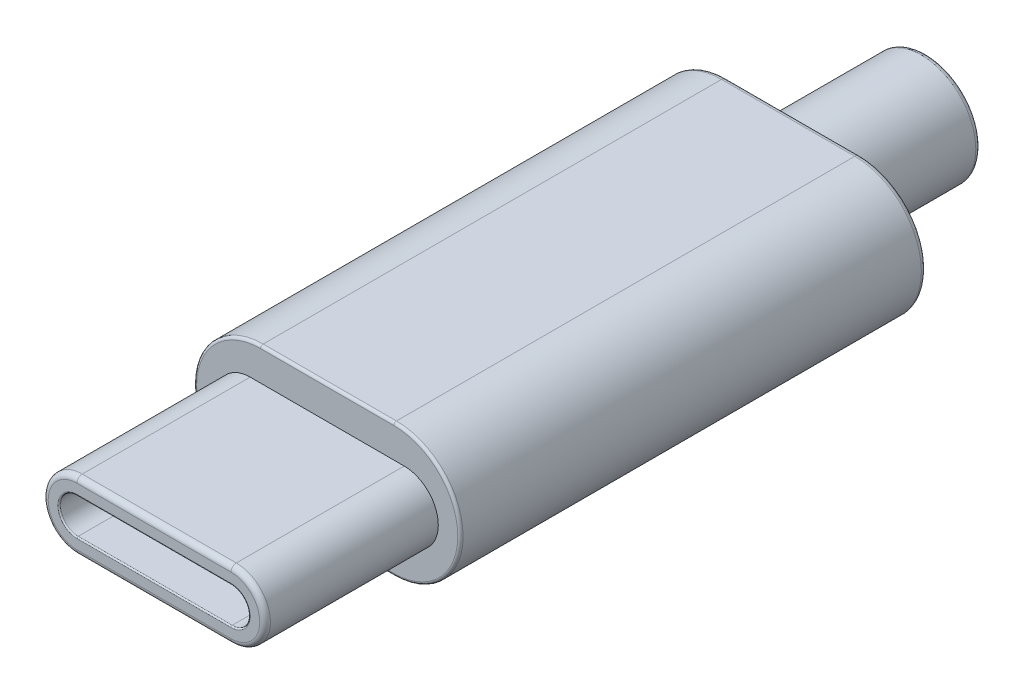
ISO-10303-21;
HEADER;
FILE_DESCRIPTION(('STEP AP214'),'2;1');
FILE_NAME('part.step','',(''),(''),'','','');
FILE_SCHEMA(('AUTOMOTIVE_DESIGN { 1 0 10303 214 1 1 1 1 }'));
ENDSEC;
DATA;
#1=APPLICATION_CONTEXT('core data for automotive mechanical design processes');
#2=APPLICATION_PROTOCOL_DEFINITION('international standard','automotive_design',2000,#1);
#3=PRODUCT_CONTEXT('',#1,'mechanical');
#4=PRODUCT('Part','Part','',(#3));
#5=PRODUCT_RELATED_PRODUCT_CATEGORY('part','',(#4));
#6=PRODUCT_DEFINITION_FORMATION('','',#4);
#7=PRODUCT_DEFINITION_CONTEXT('part definition',#1,'design');
#8=PRODUCT_DEFINITION('design','',#6,#7);
#9=PRODUCT_DEFINITION_SHAPE('','',#8);
#10=(LENGTH_UNIT() NAMED_UNIT(*) SI_UNIT(.MILLI.,.METRE.));
#11=(NAMED_UNIT(*) PLANE_ANGLE_UNIT() SI_UNIT($,.RADIAN.));
#12=(NAMED_UNIT(*) SI_UNIT($,.STERADIAN.) SOLID_ANGLE_UNIT());
#13=UNCERTAINTY_MEASURE_WITH_UNIT(LENGTH_MEASURE(1.E-05),#10,'distance_accuracy_value','');
#14=(GEOMETRIC_REPRESENTATION_CONTEXT(3) GLOBAL_UNCERTAINTY_ASSIGNED_CONTEXT((#13)) GLOBAL_UNIT_ASSIGNED_CONTEXT((#10,
#11,#12)) REPRESENTATION_CONTEXT('',''));
#15=CARTESIAN_POINT('',(0.,0.,0.));
#16=DIRECTION('',(0.,0.,1.));
#17=DIRECTION('',(1.,0.,0.));
#18=AXIS2_PLACEMENT_3D('',#15,#16,#17);
#19=CARTESIAN_POINT('',(0.,0.,0.));
#20=DIRECTION('',(0.,0.,1.));
#21=DIRECTION('',(1.,0.,0.));
#22=AXIS2_PLACEMENT_3D('',#19,#20,#21);
#23=PLANE('',#22);
#24=DIRECTION('',(-1.,0.,0.));
#25=VECTOR('',#24,1.);
#26=CARTESIAN_POINT('',(2.89,-1.28,0.));
#27=LINE('',#26,#25);
#28=CARTESIAN_POINT('',(2.89,-1.28,0.));
#29=VERTEX_POINT('',#28);
#30=CARTESIAN_POINT('',(-2.89,-1.28,0.));
#31=VERTEX_POINT('',#30);
#32=EDGE_CURVE('P0_E10',#29,#31,#27,.T.);
#33=ORIENTED_EDGE('',*,*,#32,.T.);
#34=CARTESIAN_POINT('',(-2.89,0.,0.));
#35=DIRECTION('',(0.,0.,-1.));
#36=DIRECTION('',(0.,-1.,0.));
#37=AXIS2_PLACEMENT_3D('',#34,#35,#36);
#38=CIRCLE('',#37,1.28);
#39=CARTESIAN_POINT('',(-2.89,1.28,0.));
#40=VERTEX_POINT('',#39);
#41=EDGE_CURVE('P0_E27',#31,#40,#38,.T.);
#42=ORIENTED_EDGE('',*,*,#41,.T.);
#43=DIRECTION('',(1.,0.,0.));
#44=VECTOR('',#43,1.);
#45=CARTESIAN_POINT('',(-2.89,1.28,0.));
#46=LINE('',#45,#44);
#47=CARTESIAN_POINT('',(2.89,1.28,0.));
#48=VERTEX_POINT('',#47);
#49=EDGE_CURVE('P0_E248',#40,#48,#46,.T.);
#50=ORIENTED_EDGE('',*,*,#49,.T.);
#51=CARTESIAN_POINT('',(2.89,0.,0.));
#52=DIRECTION('',(0.,0.,-1.));
#53=DIRECTION('',(0.,1.,0.));
#54=AXIS2_PLACEMENT_3D('',#51,#52,#53);
#55=CIRCLE('',#54,1.28);
#56=EDGE_CURVE('P0_E199',#48,#29,#55,.T.);
#57=ORIENTED_EDGE('',*,*,#56,.T.);
#58=EDGE_LOOP('',(#33,#42,#50,#57));
#59=FACE_BOUND('',#58,.T.);
#60=ADVANCED_FACE('P0_F16',(#59),#23,.F.);
#61=CARTESIAN_POINT('',(1.445,0.717981581539839,6.45));
#62=DIRECTION('',(1.,0.,0.));
#63=DIRECTION('',(0.,-0.707106781186555,0.70710678118654));
#64=AXIS2_PLACEMENT_3D('',#61,#62,#63);
#65=CYLINDRICAL_SURFACE('',#64,0.05);
#66=CARTESIAN_POINT('',(-2.89,0.717981581539839,6.45));
#67=DIRECTION('',(1.,0.,0.));
#68=DIRECTION('',(0.,0.,1.));
#69=AXIS2_PLACEMENT_3D('',#66,#67,#68);
#70=CIRCLE('',#69,0.05);
#71=CARTESIAN_POINT('',(-2.89,0.717981581539839,6.5));
#72=VERTEX_POINT('',#71);
#73=CARTESIAN_POINT('',(-2.89,0.667981581539839,6.45));
#74=VERTEX_POINT('',#73);
#75=EDGE_CURVE('P0_E195',#72,#74,#70,.T.);
#76=ORIENTED_EDGE('',*,*,#75,.T.);
#77=DIRECTION('',(1.,0.,0.));
#78=VECTOR('',#77,1.);
#79=CARTESIAN_POINT('',(1.445,0.667981581539839,6.45));
#80=LINE('',#79,#78);
#81=CARTESIAN_POINT('',(2.89,0.667981581539839,6.45));
#82=VERTEX_POINT('',#81);
#83=EDGE_CURVE('P0_E200',#74,#82,#80,.T.);
#84=ORIENTED_EDGE('',*,*,#83,.T.);
#85=CARTESIAN_POINT('',(2.89,0.717981581539839,6.45));
#86=DIRECTION('',(-1.,0.,0.));
#87=DIRECTION('',(0.,-1.,0.));
#88=AXIS2_PLACEMENT_3D('',#85,#86,#87);
#89=CIRCLE('',#88,0.05);
#90=CARTESIAN_POINT('',(2.89,0.717981581539839,6.5));
#91=VERTEX_POINT('',#90);
#92=EDGE_CURVE('P0_E244',#82,#91,#89,.T.);
#93=ORIENTED_EDGE('',*,*,#92,.T.);
#94=DIRECTION('',(-1.,0.,0.));
#95=VECTOR('',#94,1.);
#96=CARTESIAN_POINT('',(1.445,0.717981581539839,6.5));
#97=LINE('',#96,#95);
#98=EDGE_CURVE('P0_E193',#91,#72,#97,.T.);
#99=ORIENTED_EDGE('',*,*,#98,.T.);
#100=EDGE_LOOP('',(#76,#84,#93,#99));
#101=FACE_BOUND('',#100,.T.);
#102=ADVANCED_FACE('P0_F430',(#101),#65,.T.);
#103=CARTESIAN_POINT('',(2.89,0.,6.45));
#104=DIRECTION('',(0.,0.,-1.));
#105=DIRECTION('',(1.,0.,0.));
#106=AXIS2_PLACEMENT_3D('',#103,#104,#105);
#107=TOROIDAL_SURFACE('',#106,0.717981581539839,0.05);
#108=CARTESIAN_POINT('',(2.89,-0.717981581539839,6.45));
#109=DIRECTION('',(1.,0.,0.));
#110=DIRECTION('',(0.,1.,0.));
#111=AXIS2_PLACEMENT_3D('',#108,#109,#110);
#112=CIRCLE('',#111,0.05);
#113=CARTESIAN_POINT('',(2.89,-0.667981581539839,6.45));
#114=VERTEX_POINT('',#113);
#115=CARTESIAN_POINT('',(2.89,-0.717981581539839,6.5));
#116=VERTEX_POINT('',#115);
#117=EDGE_CURVE('P0_E155',#114,#116,#112,.T.);
#118=ORIENTED_EDGE('',*,*,#117,.T.);
#119=CARTESIAN_POINT('',(2.89,0.,6.5));
#120=DIRECTION('',(0.,0.,1.));
#121=DIRECTION('',(1.,0.,0.));
#122=AXIS2_PLACEMENT_3D('',#119,#120,#121);
#123=CIRCLE('',#122,0.717981581539839);
#124=EDGE_CURVE('P0_E194',#116,#91,#123,.T.);
#125=ORIENTED_EDGE('',*,*,#124,.T.);
#126=ORIENTED_EDGE('',*,*,#92,.F.);
#127=CARTESIAN_POINT('',(2.89,0.,6.45));
#128=DIRECTION('',(0.,0.,-1.));
#129=DIRECTION('',(1.,0.,0.));
#130=AXIS2_PLACEMENT_3D('',#127,#128,#129);
#131=CIRCLE('',#130,0.667981581539839);
#132=EDGE_CURVE('P0_E165',#82,#114,#131,.T.);
#133=ORIENTED_EDGE('',*,*,#132,.T.);
#134=EDGE_LOOP('',(#118,#125,#126,#133));
#135=FACE_BOUND('',#134,.T.);
#136=ADVANCED_FACE('P0_F450',(#135),#107,.T.);
#137=CARTESIAN_POINT('',(-1.445,-0.717981581539839,6.45));
#138=DIRECTION('',(-1.,0.,0.));
#139=DIRECTION('',(0.,0.707106781186555,0.70710678118654));
#140=AXIS2_PLACEMENT_3D('',#137,#138,#139);
#141=CYLINDRICAL_SURFACE('',#140,0.05);
#142=CARTESIAN_POINT('',(-2.89,-0.717981581539839,6.45));
#143=DIRECTION('',(1.,0.,0.));
#144=DIRECTION('',(0.,1.,0.));
#145=AXIS2_PLACEMENT_3D('',#142,#143,#144);
#146=CIRCLE('',#145,0.05);
#147=CARTESIAN_POINT('',(-2.89,-0.667981581539839,6.45));
#148=VERTEX_POINT('',#147);
#149=CARTESIAN_POINT('',(-2.89,-0.717981581539839,6.5));
#150=VERTEX_POINT('',#149);
#151=EDGE_CURVE('P0_E152',#148,#150,#146,.T.);
#152=ORIENTED_EDGE('',*,*,#151,.T.);
#153=DIRECTION('',(1.,0.,0.));
#154=VECTOR('',#153,1.);
#155=CARTESIAN_POINT('',(-1.445,-0.717981581539839,6.5));
#156=LINE('',#155,#154);
#157=EDGE_CURVE('P0_E160',#150,#116,#156,.T.);
#158=ORIENTED_EDGE('',*,*,#157,.T.);
#159=ORIENTED_EDGE('',*,*,#117,.F.);
#160=DIRECTION('',(-1.,0.,0.));
#161=VECTOR('',#160,1.);
#162=CARTESIAN_POINT('',(-1.445,-0.667981581539839,6.45));
#163=LINE('',#162,#161);
#164=EDGE_CURVE('P0_E149',#114,#148,#163,.T.);
#165=ORIENTED_EDGE('',*,*,#164,.T.);
#166=EDGE_LOOP('',(#152,#158,#159,#165));
#167=FACE_BOUND('',#166,.T.);
#168=ADVANCED_FACE('P0_F150',(#167),#141,.T.);
#169=CARTESIAN_POINT('',(-2.89,0.,6.45));
#170=DIRECTION('',(0.,0.,-1.));
#171=DIRECTION('',(-1.,0.,0.));
#172=AXIS2_PLACEMENT_3D('',#169,#170,#171);
#173=TOROIDAL_SURFACE('',#172,0.717981581539839,0.05);
#174=ORIENTED_EDGE('',*,*,#75,.F.);
#175=CARTESIAN_POINT('',(-2.89,0.,6.5));
#176=DIRECTION('',(0.,0.,1.));
#177=DIRECTION('',(-1.,0.,0.));
#178=AXIS2_PLACEMENT_3D('',#175,#176,#177);
#179=CIRCLE('',#178,0.717981581539839);
#180=EDGE_CURVE('P0_E143',#72,#150,#179,.T.);
#181=ORIENTED_EDGE('',*,*,#180,.T.);
#182=ORIENTED_EDGE('',*,*,#151,.F.);
#183=CARTESIAN_POINT('',(-2.89,0.,6.45));
#184=DIRECTION('',(0.,0.,-1.));
#185=DIRECTION('',(-1.,0.,0.));
#186=AXIS2_PLACEMENT_3D('',#183,#184,#185);
#187=CIRCLE('',#186,0.667981581539839);
#188=EDGE_CURVE('P0_E130',#148,#74,#187,.T.);
#189=ORIENTED_EDGE('',*,*,#188,.T.);
#190=EDGE_LOOP('',(#174,#181,#182,#189));
#191=FACE_BOUND('',#190,.T.);
#192=ADVANCED_FACE('P0_F162',(#191),#173,.T.);
#193=CARTESIAN_POINT('',(2.89,0.,0.));
#194=DIRECTION('',(0.,0.,1.));
#195=DIRECTION('',(0.,1.,0.));
#196=AXIS2_PLACEMENT_3D('',#193,#194,#195);
#197=CYLINDRICAL_SURFACE('',#196,0.667981581539839);
#198=ORIENTED_EDGE('',*,*,#132,.F.);
#199=DIRECTION('',(0.,0.,1.));
#200=VECTOR('',#199,1.);
#201=CARTESIAN_POINT('',(2.89,0.667981581539839,0.));
#202=LINE('',#201,#200);
#203=CARTESIAN_POINT('',(2.89,0.667981581539839,2.1294355142821));
#204=VERTEX_POINT('',#203);
#205=EDGE_CURVE('P0_E269',#204,#82,#202,.T.);
#206=ORIENTED_EDGE('',*,*,#205,.F.);
#207=CARTESIAN_POINT('',(2.89,0.,2.1294355142821));
#208=DIRECTION('',(0.,0.,-1.));
#209=DIRECTION('',(0.,1.,0.));
#210=AXIS2_PLACEMENT_3D('',#207,#208,#209);
#211=CIRCLE('',#210,0.667981581539839);
#212=CARTESIAN_POINT('',(2.89,-0.667981581539839,2.1294355142821));
#213=VERTEX_POINT('',#212);
#214=EDGE_CURVE('P0_E144',#204,#213,#211,.T.);
#215=ORIENTED_EDGE('',*,*,#214,.T.);
#216=DIRECTION('',(0.,0.,1.));
#217=VECTOR('',#216,1.);
#218=CARTESIAN_POINT('',(2.89,-0.667981581539839,0.));
#219=LINE('',#218,#217);
#220=EDGE_CURVE('P0_E262',#213,#114,#219,.T.);
#221=ORIENTED_EDGE('',*,*,#220,.T.);
#222=EDGE_LOOP('',(#198,#206,#215,#221));
#223=FACE_BOUND('',#222,.T.);
#224=ADVANCED_FACE('P0_F482',(#223),#197,.F.);
#225=CARTESIAN_POINT('',(2.89,0.667981581539839,0.));
#226=DIRECTION('',(0.,1.,0.));
#227=DIRECTION('',(1.,0.,0.));
#228=AXIS2_PLACEMENT_3D('',#225,#226,#227);
#229=PLANE('',#228);
#230=ORIENTED_EDGE('',*,*,#83,.F.);
#231=DIRECTION('',(0.,0.,1.));
#232=VECTOR('',#231,1.);
#233=CARTESIAN_POINT('',(-2.89,0.667981581539839,0.));
#234=LINE('',#233,#232);
#235=CARTESIAN_POINT('',(-2.89,0.667981581539839,2.1294355142821));
#236=VERTEX_POINT('',#235);
#237=EDGE_CURVE('P0_E137',#236,#74,#234,.T.);
#238=ORIENTED_EDGE('',*,*,#237,.F.);
#239=DIRECTION('',(1.,0.,0.));
#240=VECTOR('',#239,1.);
#241=CARTESIAN_POINT('',(1.445,0.667981581539839,2.1294355142821));
#242=LINE('',#241,#240);
#243=EDGE_CURVE('P0_E265',#236,#204,#242,.T.);
#244=ORIENTED_EDGE('',*,*,#243,.T.);
#245=ORIENTED_EDGE('',*,*,#205,.T.);
#246=EDGE_LOOP('',(#230,#238,#244,#245));
#247=FACE_BOUND('',#246,.T.);
#248=ADVANCED_FACE('P0_F465',(#247),#229,.F.);
#249=CARTESIAN_POINT('',(0.,0.,6.5));
#250=DIRECTION('',(0.,0.,1.));
#251=DIRECTION('',(1.,0.,0.));
#252=AXIS2_PLACEMENT_3D('',#249,#250,#251);
#253=PLANE('',#252);
#254=CARTESIAN_POINT('',(2.89,0.,6.5));
#255=DIRECTION('',(0.,0.,-1.));
#256=DIRECTION('',(1.,0.,0.));
#257=AXIS2_PLACEMENT_3D('',#254,#255,#256);
#258=CIRCLE('',#257,1.08);
#259=CARTESIAN_POINT('',(2.89,1.08,6.5));
#260=VERTEX_POINT('',#259);
#261=CARTESIAN_POINT('',(2.89,-1.08,6.5));
#262=VERTEX_POINT('',#261);
#263=EDGE_CURVE('P0_E219',#260,#262,#258,.T.);
#264=ORIENTED_EDGE('',*,*,#263,.F.);
#265=DIRECTION('',(1.,0.,0.));
#266=VECTOR('',#265,1.);
#267=CARTESIAN_POINT('',(1.445,1.08,6.5));
#268=LINE('',#267,#266);
#269=CARTESIAN_POINT('',(-2.89,1.08,6.5));
#270=VERTEX_POINT('',#269);
#271=EDGE_CURVE('P0_E220',#270,#260,#268,.T.);
#272=ORIENTED_EDGE('',*,*,#271,.F.);
#273=CARTESIAN_POINT('',(-2.89,0.,6.5));
#274=DIRECTION('',(0.,0.,-1.));
#275=DIRECTION('',(-1.,0.,0.));
#276=AXIS2_PLACEMENT_3D('',#273,#274,#275);
#277=CIRCLE('',#276,1.08);
#278=CARTESIAN_POINT('',(-2.89,-1.08,6.5));
#279=VERTEX_POINT('',#278);
#280=EDGE_CURVE('P0_E201',#279,#270,#277,.T.);
#281=ORIENTED_EDGE('',*,*,#280,.F.);
#282=DIRECTION('',(-1.,0.,0.));
#283=VECTOR('',#282,1.);
#284=CARTESIAN_POINT('',(-1.445,-1.08,6.5));
#285=LINE('',#284,#283);
#286=EDGE_CURVE('P0_E172',#262,#279,#285,.T.);
#287=ORIENTED_EDGE('',*,*,#286,.F.);
#288=EDGE_LOOP('',(#264,#272,#281,#287));
#289=FACE_BOUND('',#288,.T.);
#290=ORIENTED_EDGE('',*,*,#98,.F.);
#291=ORIENTED_EDGE('',*,*,#124,.F.);
#292=ORIENTED_EDGE('',*,*,#157,.F.);
#293=ORIENTED_EDGE('',*,*,#180,.F.);
#294=EDGE_LOOP('',(#290,#291,#292,#293));
#295=FACE_BOUND('',#294,.T.);
#296=ADVANCED_FACE('P0_F461',(#289,#295),#253,.T.);
#297=CARTESIAN_POINT('',(-2.89,0.,0.));
#298=DIRECTION('',(0.,0.,1.));
#299=DIRECTION('',(0.,-1.,0.));
#300=AXIS2_PLACEMENT_3D('',#297,#298,#299);
#301=CYLINDRICAL_SURFACE('',#300,0.667981581539839);
#302=ORIENTED_EDGE('',*,*,#188,.F.);
#303=DIRECTION('',(0.,0.,1.));
#304=VECTOR('',#303,1.);
#305=CARTESIAN_POINT('',(-2.89,-0.667981581539839,0.));
#306=LINE('',#305,#304);
#307=CARTESIAN_POINT('',(-2.89,-0.667981581539839,2.1294355142821));
#308=VERTEX_POINT('',#307);
#309=EDGE_CURVE('P0_E135',#308,#148,#306,.T.);
#310=ORIENTED_EDGE('',*,*,#309,.F.);
#311=CARTESIAN_POINT('',(-2.89,0.,2.1294355142821));
#312=DIRECTION('',(0.,0.,-1.));
#313=DIRECTION('',(0.,-1.,0.));
#314=AXIS2_PLACEMENT_3D('',#311,#312,#313);
#315=CIRCLE('',#314,0.667981581539839);
#316=EDGE_CURVE('P0_E184',#308,#236,#315,.T.);
#317=ORIENTED_EDGE('',*,*,#316,.T.);
#318=ORIENTED_EDGE('',*,*,#237,.T.);
#319=EDGE_LOOP('',(#302,#310,#317,#318));
#320=FACE_BOUND('',#319,.T.);
#321=ADVANCED_FACE('P0_F132',(#320),#301,.F.);
#322=CARTESIAN_POINT('',(-2.89,-0.667981581539839,0.));
#323=DIRECTION('',(0.,-1.,0.));
#324=DIRECTION('',(0.,0.,-1.));
#325=AXIS2_PLACEMENT_3D('',#322,#323,#324);
#326=PLANE('',#325);
#327=ORIENTED_EDGE('',*,*,#164,.F.);
#328=ORIENTED_EDGE('',*,*,#220,.F.);
#329=DIRECTION('',(-1.,0.,0.));
#330=VECTOR('',#329,1.);
#331=CARTESIAN_POINT('',(-1.445,-0.667981581539839,2.1294355142821));
#332=LINE('',#331,#330);
#333=EDGE_CURVE('P0_E170',#213,#308,#332,.T.);
#334=ORIENTED_EDGE('',*,*,#333,.T.);
#335=ORIENTED_EDGE('',*,*,#309,.T.);
#336=EDGE_LOOP('',(#327,#328,#334,#335));
#337=FACE_BOUND('',#336,.T.);
#338=ADVANCED_FACE('P0_F168',(#337),#326,.F.);
#339=CARTESIAN_POINT('',(0.,0.,2.1294355142821));
#340=DIRECTION('',(0.,0.,1.));
#341=DIRECTION('',(1.,0.,0.));
#342=AXIS2_PLACEMENT_3D('',#339,#340,#341);
#343=PLANE('',#342);
#344=ORIENTED_EDGE('',*,*,#333,.F.);
#345=ORIENTED_EDGE('',*,*,#214,.F.);
#346=ORIENTED_EDGE('',*,*,#243,.F.);
#347=ORIENTED_EDGE('',*,*,#316,.F.);
#348=EDGE_LOOP('',(#344,#345,#346,#347));
#349=FACE_BOUND('',#348,.T.);
#350=ADVANCED_FACE('P0_F442',(#349),#343,.T.);
#351=CARTESIAN_POINT('',(-1.445,-1.08,6.3));
#352=DIRECTION('',(1.,0.,0.));
#353=DIRECTION('',(0.,-0.707106781186547,0.707106781186548));
#354=AXIS2_PLACEMENT_3D('',#351,#352,#353);
#355=CYLINDRICAL_SURFACE('',#354,0.2);
#356=CARTESIAN_POINT('',(2.89,-1.08,6.3));
#357=DIRECTION('',(1.,0.,0.));
#358=DIRECTION('',(0.,0.,1.));
#359=AXIS2_PLACEMENT_3D('',#356,#357,#358);
#360=CIRCLE('',#359,0.2);
#361=CARTESIAN_POINT('',(2.89,-1.28,6.3));
#362=VERTEX_POINT('',#361);
#363=EDGE_CURVE('P0_E186',#262,#362,#360,.T.);
#364=ORIENTED_EDGE('',*,*,#363,.F.);
#365=ORIENTED_EDGE('',*,*,#286,.T.);
#366=CARTESIAN_POINT('',(-2.89,-1.08,6.3));
#367=DIRECTION('',(-1.,0.,0.));
#368=DIRECTION('',(0.,-1.,0.));
#369=AXIS2_PLACEMENT_3D('',#366,#367,#368);
#370=CIRCLE('',#369,0.2);
#371=CARTESIAN_POINT('',(-2.89,-1.28,6.3));
#372=VERTEX_POINT('',#371);
#373=EDGE_CURVE('P0_E204',#372,#279,#370,.T.);
#374=ORIENTED_EDGE('',*,*,#373,.F.);
#375=DIRECTION('',(1.,0.,0.));
#376=VECTOR('',#375,1.);
#377=CARTESIAN_POINT('',(-1.445,-1.28,6.3));
#378=LINE('',#377,#376);
#379=EDGE_CURVE('P0_E20',#372,#362,#378,.T.);
#380=ORIENTED_EDGE('',*,*,#379,.T.);
#381=EDGE_LOOP('',(#364,#365,#374,#380));
#382=FACE_BOUND('',#381,.T.);
#383=ADVANCED_FACE('P0_F437',(#382),#355,.T.);
#384=CARTESIAN_POINT('',(2.89,0.,6.3));
#385=DIRECTION('',(0.,0.,1.));
#386=DIRECTION('',(1.,0.,0.));
#387=AXIS2_PLACEMENT_3D('',#384,#385,#386);
#388=TOROIDAL_SURFACE('',#387,1.08,0.2);
#389=ORIENTED_EDGE('',*,*,#363,.T.);
#390=CARTESIAN_POINT('',(2.89,0.,6.3));
#391=DIRECTION('',(0.,0.,1.));
#392=DIRECTION('',(1.,0.,0.));
#393=AXIS2_PLACEMENT_3D('',#390,#391,#392);
#394=CIRCLE('',#393,1.28);
#395=CARTESIAN_POINT('',(2.89,1.28,6.3));
#396=VERTEX_POINT('',#395);
#397=EDGE_CURVE('P0_E190',#362,#396,#394,.T.);
#398=ORIENTED_EDGE('',*,*,#397,.T.);
#399=CARTESIAN_POINT('',(2.89,1.08,6.3));
#400=DIRECTION('',(1.,0.,0.));
#401=DIRECTION('',(0.,1.,0.));
#402=AXIS2_PLACEMENT_3D('',#399,#400,#401);
#403=CIRCLE('',#402,0.2);
#404=EDGE_CURVE('P0_E273',#396,#260,#403,.T.);
#405=ORIENTED_EDGE('',*,*,#404,.T.);
#406=ORIENTED_EDGE('',*,*,#263,.T.);
#407=EDGE_LOOP('',(#389,#398,#405,#406));
#408=FACE_BOUND('',#407,.T.);
#409=ADVANCED_FACE('P0_F441',(#408),#388,.T.);
#410=CARTESIAN_POINT('',(1.445,1.08,6.3));
#411=DIRECTION('',(-1.,0.,0.));
#412=DIRECTION('',(0.,0.707106781186548,0.707106781186548));
#413=AXIS2_PLACEMENT_3D('',#410,#411,#412);
#414=CYLINDRICAL_SURFACE('',#413,0.2);
#415=CARTESIAN_POINT('',(-2.89,1.08,6.3));
#416=DIRECTION('',(1.,0.,0.));
#417=DIRECTION('',(0.,1.,0.));
#418=AXIS2_PLACEMENT_3D('',#415,#416,#417);
#419=CIRCLE('',#418,0.2);
#420=CARTESIAN_POINT('',(-2.89,1.28,6.3));
#421=VERTEX_POINT('',#420);
#422=EDGE_CURVE('P0_E216',#421,#270,#419,.T.);
#423=ORIENTED_EDGE('',*,*,#422,.T.);
#424=ORIENTED_EDGE('',*,*,#271,.T.);
#425=ORIENTED_EDGE('',*,*,#404,.F.);
#426=DIRECTION('',(-1.,0.,0.));
#427=VECTOR('',#426,1.);
#428=CARTESIAN_POINT('',(1.445,1.28,6.3));
#429=LINE('',#428,#427);
#430=EDGE_CURVE('P0_E211',#396,#421,#429,.T.);
#431=ORIENTED_EDGE('',*,*,#430,.T.);
#432=EDGE_LOOP('',(#423,#424,#425,#431));
#433=FACE_BOUND('',#432,.T.);
#434=ADVANCED_FACE('P0_F418',(#433),#414,.T.);
#435=CARTESIAN_POINT('',(-2.89,0.,6.3));
#436=DIRECTION('',(0.,0.,1.));
#437=DIRECTION('',(-1.,0.,0.));
#438=AXIS2_PLACEMENT_3D('',#435,#436,#437);
#439=TOROIDAL_SURFACE('',#438,1.08,0.2);
#440=ORIENTED_EDGE('',*,*,#373,.T.);
#441=ORIENTED_EDGE('',*,*,#280,.T.);
#442=ORIENTED_EDGE('',*,*,#422,.F.);
#443=CARTESIAN_POINT('',(-2.89,0.,6.3));
#444=DIRECTION('',(0.,0.,1.));
#445=DIRECTION('',(-1.,0.,0.));
#446=AXIS2_PLACEMENT_3D('',#443,#444,#445);
#447=CIRCLE('',#446,1.28);
#448=EDGE_CURVE('P0_E205',#421,#372,#447,.T.);
#449=ORIENTED_EDGE('',*,*,#448,.T.);
#450=EDGE_LOOP('',(#440,#441,#442,#449));
#451=FACE_BOUND('',#450,.T.);
#452=ADVANCED_FACE('P0_F411',(#451),#439,.T.);
#453=CARTESIAN_POINT('',(-2.89,-1.28,0.));
#454=DIRECTION('',(0.,-1.,0.));
#455=DIRECTION('',(0.,0.,-1.));
#456=AXIS2_PLACEMENT_3D('',#453,#454,#455);
#457=PLANE('',#456);
#458=ORIENTED_EDGE('',*,*,#379,.F.);
#459=DIRECTION('',(0.,0.,1.));
#460=VECTOR('',#459,1.);
#461=CARTESIAN_POINT('',(-2.89,-1.28,0.));
#462=LINE('',#461,#460);
#463=EDGE_CURVE('P0_E212',#31,#372,#462,.T.);
#464=ORIENTED_EDGE('',*,*,#463,.F.);
#465=ORIENTED_EDGE('',*,*,#32,.F.);
#466=DIRECTION('',(0.,0.,1.));
#467=VECTOR('',#466,1.);
#468=CARTESIAN_POINT('',(2.89,-1.28,0.));
#469=LINE('',#468,#467);
#470=EDGE_CURVE('P0_E276',#29,#362,#469,.T.);
#471=ORIENTED_EDGE('',*,*,#470,.T.);
#472=EDGE_LOOP('',(#458,#464,#465,#471));
#473=FACE_BOUND('',#472,.T.);
#474=ADVANCED_FACE('P0_F417',(#473),#457,.T.);
#475=CARTESIAN_POINT('',(2.89,0.,0.));
#476=DIRECTION('',(0.,0.,1.));
#477=DIRECTION('',(0.,1.,0.));
#478=AXIS2_PLACEMENT_3D('',#475,#476,#477);
#479=CYLINDRICAL_SURFACE('',#478,1.28);
#480=ORIENTED_EDGE('',*,*,#397,.F.);
#481=ORIENTED_EDGE('',*,*,#470,.F.);
#482=ORIENTED_EDGE('',*,*,#56,.F.);
#483=DIRECTION('',(0.,0.,1.));
#484=VECTOR('',#483,1.);
#485=CARTESIAN_POINT('',(2.89,1.28,0.));
#486=LINE('',#485,#484);
#487=EDGE_CURVE('P0_E240',#48,#396,#486,.T.);
#488=ORIENTED_EDGE('',*,*,#487,.T.);
#489=EDGE_LOOP('',(#480,#481,#482,#488));
#490=FACE_BOUND('',#489,.T.);
#491=ADVANCED_FACE('P0_F302',(#490),#479,.T.);
#492=CARTESIAN_POINT('',(2.89,1.28,0.));
#493=DIRECTION('',(0.,1.,0.));
#494=DIRECTION('',(1.,0.,0.));
#495=AXIS2_PLACEMENT_3D('',#492,#493,#494);
#496=PLANE('',#495);
#497=ORIENTED_EDGE('',*,*,#430,.F.);
#498=ORIENTED_EDGE('',*,*,#487,.F.);
#499=ORIENTED_EDGE('',*,*,#49,.F.);
#500=DIRECTION('',(0.,0.,1.));
#501=VECTOR('',#500,1.);
#502=CARTESIAN_POINT('',(-2.89,1.28,0.));
#503=LINE('',#502,#501);
#504=EDGE_CURVE('P0_E215',#40,#421,#503,.T.);
#505=ORIENTED_EDGE('',*,*,#504,.T.);
#506=EDGE_LOOP('',(#497,#498,#499,#505));
#507=FACE_BOUND('',#506,.T.);
#508=ADVANCED_FACE('P0_F300',(#507),#496,.T.);
#509=CARTESIAN_POINT('',(-2.89,0.,0.));
#510=DIRECTION('',(0.,0.,1.));
#511=DIRECTION('',(0.,-1.,0.));
#512=AXIS2_PLACEMENT_3D('',#509,#510,#511);
#513=CYLINDRICAL_SURFACE('',#512,1.28);
#514=ORIENTED_EDGE('',*,*,#448,.F.);
#515=ORIENTED_EDGE('',*,*,#504,.F.);
#516=ORIENTED_EDGE('',*,*,#41,.F.);
#517=ORIENTED_EDGE('',*,*,#463,.T.);
#518=EDGE_LOOP('',(#514,#515,#516,#517));
#519=FACE_BOUND('',#518,.T.);
#520=ADVANCED_FACE('P0_F18',(#519),#513,.T.);
#521=CLOSED_SHELL('',(#60,#102,#136,#168,#192,#224,#248,#296,#321,#338,#350,#383,#409,#434,#452,
#474,#491,#508,#520));
#522=MANIFOLD_SOLID_BREP('P0_B1',#521);
#523=CARTESIAN_POINT('',(0.,0.,-17.6));
#524=DIRECTION('',(0.,0.,1.));
#525=DIRECTION('',(1.,0.,0.));
#526=AXIS2_PLACEMENT_3D('',#523,#524,#525);
#527=TOROIDAL_SURFACE('',#526,2.14241187989637,0.1);
#528=CARTESIAN_POINT('',(0.,0.,-17.6));
#529=DIRECTION('',(0.,0.,1.));
#530=DIRECTION('',(0.,1.,0.));
#531=AXIS2_PLACEMENT_3D('',#528,#529,#530);
#532=CIRCLE('',#531,2.04241187989637);
#533=CARTESIAN_POINT('',(-2.04241187989637,0.,-17.6));
#534=VERTEX_POINT('',#533);
#535=EDGE_CURVE('P1_E11',#534,#534,#532,.T.);
#536=ORIENTED_EDGE('',*,*,#535,.T.);
#537=CARTESIAN_POINT('',(-2.14241187989637,0.,-17.6));
#538=DIRECTION('',(0.,-1.,0.));
#539=DIRECTION('',(-1.,0.,0.));
#540=AXIS2_PLACEMENT_3D('',#537,#538,#539);
#541=CIRCLE('',#540,0.1);
#542=CARTESIAN_POINT('',(-2.14241187989637,0.,-17.5));
#543=VERTEX_POINT('',#542);
#544=EDGE_CURVE('P1_E28',#534,#543,#541,.T.);
#545=ORIENTED_EDGE('',*,*,#544,.T.);
#546=CARTESIAN_POINT('',(0.,0.,-17.5));
#547=DIRECTION('',(0.,0.,-1.));
#548=DIRECTION('',(0.,1.,0.));
#549=AXIS2_PLACEMENT_3D('',#546,#547,#548);
#550=CIRCLE('',#549,2.14241187989637);
#551=EDGE_CURVE('P1_E141',#543,#543,#550,.T.);
#552=ORIENTED_EDGE('',*,*,#551,.T.);
#553=ORIENTED_EDGE('',*,*,#544,.F.);
#554=EDGE_LOOP('',(#536,#545,#552,#553));
#555=FACE_BOUND('',#554,.T.);
#556=ADVANCED_FACE('P1_F17',(#555),#527,.F.);
#557=CARTESIAN_POINT('',(0.,0.,-17.5));
#558=DIRECTION('',(0.,0.,-1.));
#559=DIRECTION('',(1.,0.,0.));
#560=AXIS2_PLACEMENT_3D('',#557,#558,#559);
#561=CYLINDRICAL_SURFACE('',#560,2.04241187989637);
#562=CARTESIAN_POINT('',(0.,0.,-22.3));
#563=DIRECTION('',(0.,0.,-1.));
#564=DIRECTION('',(1.,0.,0.));
#565=AXIS2_PLACEMENT_3D('',#562,#563,#564);
#566=CIRCLE('',#565,2.04241187989637);
#567=CARTESIAN_POINT('',(-2.04241187989637,0.,-22.3));
#568=VERTEX_POINT('',#567);
#569=CARTESIAN_POINT('',(2.04241187989637,0.,-22.3));
#570=VERTEX_POINT('',#569);
#571=EDGE_CURVE('P1_E129',#568,#570,#566,.T.);
#572=ORIENTED_EDGE('',*,*,#571,.F.);
#573=DIRECTION('',(0.,0.,1.));
#574=VECTOR('',#573,1.);
#575=CARTESIAN_POINT('',(-2.04241187989637,0.,-17.5));
#576=LINE('',#575,#574);
#577=EDGE_CURVE('P1_E132',#568,#534,#576,.T.);
#578=ORIENTED_EDGE('',*,*,#577,.T.);
#579=ORIENTED_EDGE('',*,*,#535,.F.);
#580=ORIENTED_EDGE('',*,*,#577,.F.);
#581=CARTESIAN_POINT('',(0.,0.,-22.3));
#582=DIRECTION('',(0.,0.,-1.));
#583=DIRECTION('',(1.,0.,0.));
#584=AXIS2_PLACEMENT_3D('',#581,#582,#583);
#585=CIRCLE('',#584,2.04241187989637);
#586=EDGE_CURVE('P1_E21',#570,#568,#585,.T.);
#587=ORIENTED_EDGE('',*,*,#586,.F.);
#588=EDGE_LOOP('',(#572,#578,#579,#580,#587));
#589=FACE_BOUND('',#588,.T.);
#590=ADVANCED_FACE('P1_F131',(#589),#561,.T.);
#591=CARTESIAN_POINT('',(0.,0.,-17.5));
#592=DIRECTION('',(0.,0.,1.));
#593=DIRECTION('',(1.,0.,0.));
#594=AXIS2_PLACEMENT_3D('',#591,#592,#593);
#595=PLANE('',#594);
#596=DIRECTION('',(-1.,0.,0.));
#597=VECTOR('',#596,1.);
#598=CARTESIAN_POINT('',(-1.25,2.3,-17.5));
#599=LINE('',#598,#597);
#600=CARTESIAN_POINT('',(2.5,2.3,-17.5));
#601=VERTEX_POINT('',#600);
#602=CARTESIAN_POINT('',(-2.5,2.3,-17.5));
#603=VERTEX_POINT('',#602);
#604=EDGE_CURVE('P1_E208',#601,#603,#599,.T.);
#605=ORIENTED_EDGE('',*,*,#604,.F.);
#606=CARTESIAN_POINT('',(2.5,0.,-17.5));
#607=DIRECTION('',(0.,0.,1.));
#608=DIRECTION('',(1.,0.,0.));
#609=AXIS2_PLACEMENT_3D('',#606,#607,#608);
#610=CIRCLE('',#609,2.3);
#611=CARTESIAN_POINT('',(2.5,-2.3,-17.5));
#612=VERTEX_POINT('',#611);
#613=EDGE_CURVE('P1_E161',#612,#601,#610,.T.);
#614=ORIENTED_EDGE('',*,*,#613,.F.);
#615=DIRECTION('',(1.,0.,0.));
#616=VECTOR('',#615,1.);
#617=CARTESIAN_POINT('',(1.25,-2.3,-17.5));
#618=LINE('',#617,#616);
#619=CARTESIAN_POINT('',(-2.5,-2.3,-17.5));
#620=VERTEX_POINT('',#619);
#621=EDGE_CURVE('P1_E217',#620,#612,#618,.T.);
#622=ORIENTED_EDGE('',*,*,#621,.F.);
#623=CARTESIAN_POINT('',(-2.5,0.,-17.5));
#624=DIRECTION('',(0.,0.,1.));
#625=DIRECTION('',(-1.,0.,0.));
#626=AXIS2_PLACEMENT_3D('',#623,#624,#625);
#627=CIRCLE('',#626,2.3);
#628=EDGE_CURVE('P1_E159',#603,#620,#627,.T.);
#629=ORIENTED_EDGE('',*,*,#628,.F.);
#630=EDGE_LOOP('',(#605,#614,#622,#629));
#631=FACE_BOUND('',#630,.T.);
#632=ORIENTED_EDGE('',*,*,#551,.F.);
#633=EDGE_LOOP('',(#632));
#634=FACE_BOUND('',#633,.T.);
#635=ADVANCED_FACE('P1_F297',(#631,#634),#595,.F.);
#636=CARTESIAN_POINT('',(0.,0.,-22.3));
#637=DIRECTION('',(0.,0.,-1.));
#638=DIRECTION('',(-1.,0.,0.));
#639=AXIS2_PLACEMENT_3D('',#636,#637,#638);
#640=TOROIDAL_SURFACE('',#639,1.84241187989637,0.2);
#641=CARTESIAN_POINT('',(0.,0.,-22.5));
#642=DIRECTION('',(0.,0.,1.));
#643=DIRECTION('',(1.,0.,0.));
#644=AXIS2_PLACEMENT_3D('',#641,#642,#643);
#645=CIRCLE('',#644,1.84241187989637);
#646=CARTESIAN_POINT('',(1.84241187989637,0.,-22.5));
#647=VERTEX_POINT('',#646);
#648=EDGE_CURVE('P1_E142',#647,#647,#645,.T.);
#649=ORIENTED_EDGE('',*,*,#648,.T.);
#650=CARTESIAN_POINT('',(1.84241187989637,0.,-22.3));
#651=DIRECTION('',(0.,-1.,0.));
#652=DIRECTION('',(1.,0.,0.));
#653=AXIS2_PLACEMENT_3D('',#650,#651,#652);
#654=CIRCLE('',#653,0.2);
#655=EDGE_CURVE('P1_E146',#647,#570,#654,.T.);
#656=ORIENTED_EDGE('',*,*,#655,.T.);
#657=ORIENTED_EDGE('',*,*,#586,.T.);
#658=ORIENTED_EDGE('',*,*,#571,.T.);
#659=ORIENTED_EDGE('',*,*,#655,.F.);
#660=EDGE_LOOP('',(#649,#656,#657,#658,#659));
#661=FACE_BOUND('',#660,.T.);
#662=ADVANCED_FACE('P1_F145',(#661),#640,.T.);
#663=CARTESIAN_POINT('',(-1.25,2.3,-17.3));
#664=DIRECTION('',(1.,0.,0.));
#665=DIRECTION('',(0.,0.707106781186548,-0.707106781186548));
#666=AXIS2_PLACEMENT_3D('',#663,#664,#665);
#667=CYLINDRICAL_SURFACE('',#666,0.2);
#668=CARTESIAN_POINT('',(-2.5,2.3,-17.3));
#669=DIRECTION('',(1.,0.,0.));
#670=DIRECTION('',(0.,0.,-1.));
#671=AXIS2_PLACEMENT_3D('',#668,#669,#670);
#672=CIRCLE('',#671,0.2);
#673=CARTESIAN_POINT('',(-2.5,2.5,-17.3));
#674=VERTEX_POINT('',#673);
#675=EDGE_CURVE('P1_E138',#603,#674,#672,.T.);
#676=ORIENTED_EDGE('',*,*,#675,.T.);
#677=DIRECTION('',(1.,0.,0.));
#678=VECTOR('',#677,1.);
#679=CARTESIAN_POINT('',(-1.25,2.5,-17.3));
#680=LINE('',#679,#678);
#681=CARTESIAN_POINT('',(2.5,2.5,-17.3));
#682=VERTEX_POINT('',#681);
#683=EDGE_CURVE('P1_E216',#674,#682,#680,.T.);
#684=ORIENTED_EDGE('',*,*,#683,.T.);
#685=CARTESIAN_POINT('',(2.5,2.3,-17.3));
#686=DIRECTION('',(-1.,0.,0.));
#687=DIRECTION('',(0.,1.,0.));
#688=AXIS2_PLACEMENT_3D('',#685,#686,#687);
#689=CIRCLE('',#688,0.2);
#690=EDGE_CURVE('P1_E212',#682,#601,#689,.T.);
#691=ORIENTED_EDGE('',*,*,#690,.T.);
#692=ORIENTED_EDGE('',*,*,#604,.T.);
#693=EDGE_LOOP('',(#676,#684,#691,#692));
#694=FACE_BOUND('',#693,.T.);
#695=ADVANCED_FACE('P1_F303',(#694),#667,.T.);
#696=CARTESIAN_POINT('',(2.5,0.,-17.3));
#697=DIRECTION('',(0.,0.,-1.));
#698=DIRECTION('',(1.,0.,0.));
#699=AXIS2_PLACEMENT_3D('',#696,#697,#698);
#700=TOROIDAL_SURFACE('',#699,2.3,0.2);
#701=CARTESIAN_POINT('',(2.5,-2.3,-17.3));
#702=DIRECTION('',(1.,0.,0.));
#703=DIRECTION('',(0.,-1.,0.));
#704=AXIS2_PLACEMENT_3D('',#701,#702,#703);
#705=CIRCLE('',#704,0.2);
#706=CARTESIAN_POINT('',(2.5,-2.5,-17.3));
#707=VERTEX_POINT('',#706);
#708=EDGE_CURVE('P1_E165',#707,#612,#705,.T.);
#709=ORIENTED_EDGE('',*,*,#708,.T.);
#710=ORIENTED_EDGE('',*,*,#613,.T.);
#711=ORIENTED_EDGE('',*,*,#690,.F.);
#712=CARTESIAN_POINT('',(2.5,0.,-17.3));
#713=DIRECTION('',(0.,0.,-1.));
#714=DIRECTION('',(1.,0.,0.));
#715=AXIS2_PLACEMENT_3D('',#712,#713,#714);
#716=CIRCLE('',#715,2.5);
#717=EDGE_CURVE('P1_E166',#682,#707,#716,.T.);
#718=ORIENTED_EDGE('',*,*,#717,.T.);
#719=EDGE_LOOP('',(#709,#710,#711,#718));
#720=FACE_BOUND('',#719,.T.);
#721=ADVANCED_FACE('P1_F306',(#720),#700,.T.);
#722=CARTESIAN_POINT('',(1.25,-2.3,-17.3));
#723=DIRECTION('',(-1.,0.,0.));
#724=DIRECTION('',(0.,-0.707106781186548,-0.707106781186548));
#725=AXIS2_PLACEMENT_3D('',#722,#723,#724);
#726=CYLINDRICAL_SURFACE('',#725,0.2);
#727=CARTESIAN_POINT('',(-2.5,-2.3,-17.3));
#728=DIRECTION('',(1.,0.,0.));
#729=DIRECTION('',(0.,-1.,0.));
#730=AXIS2_PLACEMENT_3D('',#727,#728,#729);
#731=CIRCLE('',#730,0.2);
#732=CARTESIAN_POINT('',(-2.5,-2.5,-17.3));
#733=VERTEX_POINT('',#732);
#734=EDGE_CURVE('P1_E220',#733,#620,#731,.T.);
#735=ORIENTED_EDGE('',*,*,#734,.T.);
#736=ORIENTED_EDGE('',*,*,#621,.T.);
#737=ORIENTED_EDGE('',*,*,#708,.F.);
#738=DIRECTION('',(-1.,0.,0.));
#739=VECTOR('',#738,1.);
#740=CARTESIAN_POINT('',(1.25,-2.5,-17.3));
#741=LINE('',#740,#739);
#742=EDGE_CURVE('P1_E85',#707,#733,#741,.T.);
#743=ORIENTED_EDGE('',*,*,#742,.T.);
#744=EDGE_LOOP('',(#735,#736,#737,#743));
#745=FACE_BOUND('',#744,.T.);
#746=ADVANCED_FACE('P1_F309',(#745),#726,.T.);
#747=CARTESIAN_POINT('',(-2.5,0.,-17.3));
#748=DIRECTION('',(0.,0.,-1.));
#749=DIRECTION('',(-1.,0.,0.));
#750=AXIS2_PLACEMENT_3D('',#747,#748,#749);
#751=TOROIDAL_SURFACE('',#750,2.3,0.2);
#752=ORIENTED_EDGE('',*,*,#675,.F.);
#753=ORIENTED_EDGE('',*,*,#628,.T.);
#754=ORIENTED_EDGE('',*,*,#734,.F.);
#755=CARTESIAN_POINT('',(-2.5,0.,-17.3));
#756=DIRECTION('',(0.,0.,-1.));
#757=DIRECTION('',(-1.,0.,0.));
#758=AXIS2_PLACEMENT_3D('',#755,#756,#757);
#759=CIRCLE('',#758,2.5);
#760=EDGE_CURVE('P1_E98',#733,#674,#759,.T.);
#761=ORIENTED_EDGE('',*,*,#760,.T.);
#762=EDGE_LOOP('',(#752,#753,#754,#761));
#763=FACE_BOUND('',#762,.T.);
#764=ADVANCED_FACE('P1_F312',(#763),#751,.T.);
#765=CARTESIAN_POINT('',(2.5,0.,0.));
#766=DIRECTION('',(0.,0.,-1.));
#767=DIRECTION('',(0.,-1.,0.));
#768=AXIS2_PLACEMENT_3D('',#765,#766,#767);
#769=CYLINDRICAL_SURFACE('',#768,2.5);
#770=ORIENTED_EDGE('',*,*,#717,.F.);
#771=DIRECTION('',(0.,0.,-1.));
#772=VECTOR('',#771,1.);
#773=CARTESIAN_POINT('',(2.5,2.5,0.));
#774=LINE('',#773,#772);
#775=CARTESIAN_POINT('',(2.5,2.5,-0.1));
#776=VERTEX_POINT('',#775);
#777=EDGE_CURVE('P1_E192',#776,#682,#774,.T.);
#778=ORIENTED_EDGE('',*,*,#777,.F.);
#779=CARTESIAN_POINT('',(2.5,0.,-0.1));
#780=DIRECTION('',(0.,0.,1.));
#781=DIRECTION('',(1.,0.,0.));
#782=AXIS2_PLACEMENT_3D('',#779,#780,#781);
#783=CIRCLE('',#782,2.5);
#784=CARTESIAN_POINT('',(2.5,-2.5,-0.1));
#785=VERTEX_POINT('',#784);
#786=EDGE_CURVE('P1_E108',#785,#776,#783,.T.);
#787=ORIENTED_EDGE('',*,*,#786,.F.);
#788=DIRECTION('',(0.,0.,-1.));
#789=VECTOR('',#788,1.);
#790=CARTESIAN_POINT('',(2.5,-2.5,0.));
#791=LINE('',#790,#789);
#792=EDGE_CURVE('P1_E181',#785,#707,#791,.T.);
#793=ORIENTED_EDGE('',*,*,#792,.T.);
#794=EDGE_LOOP('',(#770,#778,#787,#793));
#795=FACE_BOUND('',#794,.T.);
#796=ADVANCED_FACE('P1_F317',(#795),#769,.T.);
#797=CARTESIAN_POINT('',(-2.5,2.5,0.));
#798=DIRECTION('',(0.,1.,0.));
#799=DIRECTION('',(1.,0.,0.));
#800=AXIS2_PLACEMENT_3D('',#797,#798,#799);
#801=PLANE('',#800);
#802=ORIENTED_EDGE('',*,*,#683,.F.);
#803=DIRECTION('',(0.,0.,-1.));
#804=VECTOR('',#803,1.);
#805=CARTESIAN_POINT('',(-2.5,2.5,0.));
#806=LINE('',#805,#804);
#807=CARTESIAN_POINT('',(-2.5,2.5,-0.1));
#808=VERTEX_POINT('',#807);
#809=EDGE_CURVE('P1_E175',#808,#674,#806,.T.);
#810=ORIENTED_EDGE('',*,*,#809,.F.);
#811=DIRECTION('',(-1.,0.,0.));
#812=VECTOR('',#811,1.);
#813=CARTESIAN_POINT('',(-1.25,2.5,-0.1));
#814=LINE('',#813,#812);
#815=EDGE_CURVE('P1_E202',#776,#808,#814,.T.);
#816=ORIENTED_EDGE('',*,*,#815,.F.);
#817=ORIENTED_EDGE('',*,*,#777,.T.);
#818=EDGE_LOOP('',(#802,#810,#816,#817));
#819=FACE_BOUND('',#818,.T.);
#820=ADVANCED_FACE('P1_F273',(#819),#801,.T.);
#821=CARTESIAN_POINT('',(2.5,-2.5,0.));
#822=DIRECTION('',(0.,-1.,0.));
#823=DIRECTION('',(0.,0.,-1.));
#824=AXIS2_PLACEMENT_3D('',#821,#822,#823);
#825=PLANE('',#824);
#826=ORIENTED_EDGE('',*,*,#742,.F.);
#827=ORIENTED_EDGE('',*,*,#792,.F.);
#828=DIRECTION('',(1.,0.,0.));
#829=VECTOR('',#828,1.);
#830=CARTESIAN_POINT('',(1.25,-2.5,-0.1));
#831=LINE('',#830,#829);
#832=CARTESIAN_POINT('',(-2.5,-2.5,-0.1));
#833=VERTEX_POINT('',#832);
#834=EDGE_CURVE('P1_E236',#833,#785,#831,.T.);
#835=ORIENTED_EDGE('',*,*,#834,.F.);
#836=DIRECTION('',(0.,0.,-1.));
#837=VECTOR('',#836,1.);
#838=CARTESIAN_POINT('',(-2.5,-2.5,0.));
#839=LINE('',#838,#837);
#840=EDGE_CURVE('P1_E199',#833,#733,#839,.T.);
#841=ORIENTED_EDGE('',*,*,#840,.T.);
#842=EDGE_LOOP('',(#826,#827,#835,#841));
#843=FACE_BOUND('',#842,.T.);
#844=ADVANCED_FACE('P1_F326',(#843),#825,.T.);
#845=CARTESIAN_POINT('',(-1.25,2.4,-0.1));
#846=DIRECTION('',(-1.,0.,0.));
#847=DIRECTION('',(0.,0.707106781186548,0.707106781186547));
#848=AXIS2_PLACEMENT_3D('',#845,#846,#847);
#849=CYLINDRICAL_SURFACE('',#848,0.1);
#850=CARTESIAN_POINT('',(2.5,2.4,-0.1));
#851=DIRECTION('',(-1.,0.,0.));
#852=DIRECTION('',(0.,0.,1.));
#853=AXIS2_PLACEMENT_3D('',#850,#851,#852);
#854=CIRCLE('',#853,0.1);
#855=CARTESIAN_POINT('',(2.5,2.4,0.));
#856=VERTEX_POINT('',#855);
#857=EDGE_CURVE('P1_E206',#856,#776,#854,.T.);
#858=ORIENTED_EDGE('',*,*,#857,.T.);
#859=ORIENTED_EDGE('',*,*,#815,.T.);
#860=CARTESIAN_POINT('',(-2.5,2.4,-0.1));
#861=DIRECTION('',(1.,0.,0.));
#862=DIRECTION('',(0.,1.,0.));
#863=AXIS2_PLACEMENT_3D('',#860,#861,#862);
#864=CIRCLE('',#863,0.1);
#865=CARTESIAN_POINT('',(-2.5,2.4,0.));
#866=VERTEX_POINT('',#865);
#867=EDGE_CURVE('P1_E207',#808,#866,#864,.T.);
#868=ORIENTED_EDGE('',*,*,#867,.T.);
#869=DIRECTION('',(1.,0.,0.));
#870=VECTOR('',#869,1.);
#871=CARTESIAN_POINT('',(-1.25,2.4,0.));
#872=LINE('',#871,#870);
#873=EDGE_CURVE('P1_E170',#866,#856,#872,.T.);
#874=ORIENTED_EDGE('',*,*,#873,.T.);
#875=EDGE_LOOP('',(#858,#859,#868,#874));
#876=FACE_BOUND('',#875,.T.);
#877=ADVANCED_FACE('P1_F279',(#876),#849,.T.);
#878=CARTESIAN_POINT('',(-2.5,0.,-0.1));
#879=DIRECTION('',(0.,0.,1.));
#880=DIRECTION('',(-1.,0.,0.));
#881=AXIS2_PLACEMENT_3D('',#878,#879,#880);
#882=TOROIDAL_SURFACE('',#881,2.4,0.1);
#883=CARTESIAN_POINT('',(-2.5,-2.4,-0.1));
#884=DIRECTION('',(-1.,0.,0.));
#885=DIRECTION('',(0.,-1.,0.));
#886=AXIS2_PLACEMENT_3D('',#883,#884,#885);
#887=CIRCLE('',#886,0.1);
#888=CARTESIAN_POINT('',(-2.5,-2.4,0.));
#889=VERTEX_POINT('',#888);
#890=EDGE_CURVE('P1_E167',#833,#889,#887,.T.);
#891=ORIENTED_EDGE('',*,*,#890,.T.);
#892=CARTESIAN_POINT('',(-2.5,0.,0.));
#893=DIRECTION('',(0.,0.,-1.));
#894=DIRECTION('',(-1.,0.,0.));
#895=AXIS2_PLACEMENT_3D('',#892,#893,#894);
#896=CIRCLE('',#895,2.4);
#897=EDGE_CURVE('P1_E68',#889,#866,#896,.T.);
#898=ORIENTED_EDGE('',*,*,#897,.T.);
#899=ORIENTED_EDGE('',*,*,#867,.F.);
#900=CARTESIAN_POINT('',(-2.5,0.,-0.1));
#901=DIRECTION('',(0.,0.,1.));
#902=DIRECTION('',(-1.,0.,0.));
#903=AXIS2_PLACEMENT_3D('',#900,#901,#902);
#904=CIRCLE('',#903,2.5);
#905=EDGE_CURVE('P1_E176',#808,#833,#904,.T.);
#906=ORIENTED_EDGE('',*,*,#905,.T.);
#907=EDGE_LOOP('',(#891,#898,#899,#906));
#908=FACE_BOUND('',#907,.T.);
#909=ADVANCED_FACE('P1_F19',(#908),#882,.T.);
#910=CARTESIAN_POINT('',(0.,0.,0.));
#911=DIRECTION('',(0.,0.,1.));
#912=DIRECTION('',(1.,0.,0.));
#913=AXIS2_PLACEMENT_3D('',#910,#911,#912);
#914=PLANE('',#913);
#915=ORIENTED_EDGE('',*,*,#873,.F.);
#916=ORIENTED_EDGE('',*,*,#897,.F.);
#917=DIRECTION('',(-1.,0.,0.));
#918=VECTOR('',#917,1.);
#919=CARTESIAN_POINT('',(1.25,-2.4,0.));
#920=LINE('',#919,#918);
#921=CARTESIAN_POINT('',(2.5,-2.4,0.));
#922=VERTEX_POINT('',#921);
#923=EDGE_CURVE('P1_E58',#922,#889,#920,.T.);
#924=ORIENTED_EDGE('',*,*,#923,.F.);
#925=CARTESIAN_POINT('',(2.5,0.,0.));
#926=DIRECTION('',(0.,0.,-1.));
#927=DIRECTION('',(1.,0.,0.));
#928=AXIS2_PLACEMENT_3D('',#925,#926,#927);
#929=CIRCLE('',#928,2.4);
#930=EDGE_CURVE('P1_E179',#856,#922,#929,.T.);
#931=ORIENTED_EDGE('',*,*,#930,.F.);
#932=EDGE_LOOP('',(#915,#916,#924,#931));
#933=FACE_BOUND('',#932,.T.);
#934=ADVANCED_FACE('P1_F281',(#933),#914,.T.);
#935=CARTESIAN_POINT('',(2.5,0.,-0.1));
#936=DIRECTION('',(0.,0.,1.));
#937=DIRECTION('',(1.,0.,0.));
#938=AXIS2_PLACEMENT_3D('',#935,#936,#937);
#939=TOROIDAL_SURFACE('',#938,2.4,0.1);
#940=ORIENTED_EDGE('',*,*,#857,.F.);
#941=ORIENTED_EDGE('',*,*,#930,.T.);
#942=CARTESIAN_POINT('',(2.5,-2.4,-0.1));
#943=DIRECTION('',(-1.,0.,0.));
#944=DIRECTION('',(0.,-1.,0.));
#945=AXIS2_PLACEMENT_3D('',#942,#943,#944);
#946=CIRCLE('',#945,0.1);
#947=EDGE_CURVE('P1_E171',#785,#922,#946,.T.);
#948=ORIENTED_EDGE('',*,*,#947,.F.);
#949=ORIENTED_EDGE('',*,*,#786,.T.);
#950=EDGE_LOOP('',(#940,#941,#948,#949));
#951=FACE_BOUND('',#950,.T.);
#952=ADVANCED_FACE('P1_F280',(#951),#939,.T.);
#953=CARTESIAN_POINT('',(-2.5,0.,0.));
#954=DIRECTION('',(0.,0.,-1.));
#955=DIRECTION('',(0.,1.,0.));
#956=AXIS2_PLACEMENT_3D('',#953,#954,#955);
#957=CYLINDRICAL_SURFACE('',#956,2.5);
#958=ORIENTED_EDGE('',*,*,#760,.F.);
#959=ORIENTED_EDGE('',*,*,#840,.F.);
#960=ORIENTED_EDGE('',*,*,#905,.F.);
#961=ORIENTED_EDGE('',*,*,#809,.T.);
#962=EDGE_LOOP('',(#958,#959,#960,#961));
#963=FACE_BOUND('',#962,.T.);
#964=ADVANCED_FACE('P1_F267',(#963),#957,.T.);
#965=CARTESIAN_POINT('',(1.25,-2.4,-0.1));
#966=DIRECTION('',(1.,0.,0.));
#967=DIRECTION('',(0.,-0.707106781186548,0.707106781186547));
#968=AXIS2_PLACEMENT_3D('',#965,#966,#967);
#969=CYLINDRICAL_SURFACE('',#968,0.1);
#970=ORIENTED_EDGE('',*,*,#947,.T.);
#971=ORIENTED_EDGE('',*,*,#923,.T.);
#972=ORIENTED_EDGE('',*,*,#890,.F.);
#973=ORIENTED_EDGE('',*,*,#834,.T.);
#974=EDGE_LOOP('',(#970,#971,#972,#973));
#975=FACE_BOUND('',#974,.T.);
#976=ADVANCED_FACE('P1_F301',(#975),#969,.T.);
#977=CARTESIAN_POINT('',(0.,0.,-22.5));
#978=DIRECTION('',(0.,0.,-1.));
#979=DIRECTION('',(0.,-1.,0.));
#980=AXIS2_PLACEMENT_3D('',#977,#978,#979);
#981=PLANE('',#980);
#982=ORIENTED_EDGE('',*,*,#648,.F.);
#983=EDGE_LOOP('',(#982));
#984=FACE_BOUND('',#983,.T.);
#985=ADVANCED_FACE('P1_F349',(#984),#981,.T.);
#986=CLOSED_SHELL('',(#556,#590,#635,#662,#695,#721,#746,#764,#796,#820,#844,#877,#909,#934,
#952,#964,#976,#985));
#987=MANIFOLD_SOLID_BREP('P1_B1',#986);
#988=ADVANCED_BREP_SHAPE_REPRESENTATION('',(#18,#522,#987),#14);
#989=SHAPE_DEFINITION_REPRESENTATION(#9,#988);
ENDSEC;
END-ISO-10303-21;
